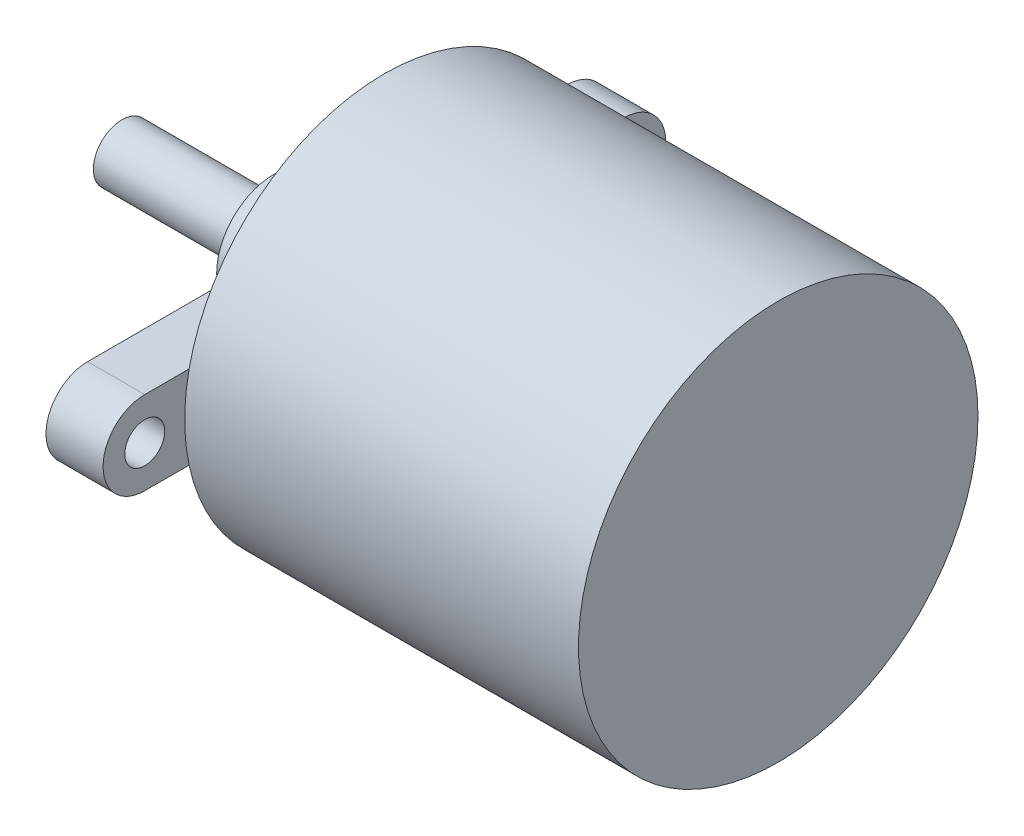
ISO-10303-21;
HEADER;
FILE_DESCRIPTION(('STEP AP214'),'2;1');
FILE_NAME('part.step','',(''),(''),'','','');
FILE_SCHEMA(('AUTOMOTIVE_DESIGN { 1 0 10303 214 1 1 1 1 }'));
ENDSEC;
DATA;
#1=APPLICATION_CONTEXT('core data for automotive mechanical design processes');
#2=APPLICATION_PROTOCOL_DEFINITION('international standard','automotive_design',2000,#1);
#3=PRODUCT_CONTEXT('',#1,'mechanical');
#4=PRODUCT('Part','Part','',(#3));
#5=PRODUCT_RELATED_PRODUCT_CATEGORY('part','',(#4));
#6=PRODUCT_DEFINITION_FORMATION('','',#4);
#7=PRODUCT_DEFINITION_CONTEXT('part definition',#1,'design');
#8=PRODUCT_DEFINITION('design','',#6,#7);
#9=PRODUCT_DEFINITION_SHAPE('','',#8);
#10=(LENGTH_UNIT() NAMED_UNIT(*) SI_UNIT(.MILLI.,.METRE.));
#11=(NAMED_UNIT(*) PLANE_ANGLE_UNIT() SI_UNIT($,.RADIAN.));
#12=(NAMED_UNIT(*) SI_UNIT($,.STERADIAN.) SOLID_ANGLE_UNIT());
#13=UNCERTAINTY_MEASURE_WITH_UNIT(LENGTH_MEASURE(1.E-05),#10,'distance_accuracy_value','');
#14=(GEOMETRIC_REPRESENTATION_CONTEXT(3) GLOBAL_UNCERTAINTY_ASSIGNED_CONTEXT((#13)) GLOBAL_UNIT_ASSIGNED_CONTEXT((#10,
#11,#12)) REPRESENTATION_CONTEXT('',''));
#15=CARTESIAN_POINT('',(0.,0.,0.));
#16=DIRECTION('',(0.,0.,1.));
#17=DIRECTION('',(1.,0.,0.));
#18=AXIS2_PLACEMENT_3D('',#15,#16,#17);
#19=CARTESIAN_POINT('',(-9.7,0.,0.));
#20=DIRECTION('',(-1.,0.,0.));
#21=DIRECTION('',(0.,0.,1.));
#22=AXIS2_PLACEMENT_3D('',#19,#20,#21);
#23=PLANE('',#22);
#24=CARTESIAN_POINT('',(-9.7,0.,0.));
#25=DIRECTION('',(-1.,0.,0.));
#26=DIRECTION('',(0.,0.,1.));
#27=AXIS2_PLACEMENT_3D('',#24,#25,#26);
#28=CIRCLE('',#27,5.);
#29=CARTESIAN_POINT('',(-9.7,0.,5.));
#30=VERTEX_POINT('',#29);
#31=EDGE_CURVE('E124',#30,#30,#28,.T.);
#32=ORIENTED_EDGE('',*,*,#31,.T.);
#33=EDGE_LOOP('',(#32));
#34=FACE_BOUND('',#33,.T.);
#35=CARTESIAN_POINT('',(-9.7,0.,0.));
#36=DIRECTION('',(-1.,0.,0.));
#37=DIRECTION('',(0.,0.,1.));
#38=AXIS2_PLACEMENT_3D('',#35,#36,#37);
#39=CIRCLE('',#38,2.5);
#40=CARTESIAN_POINT('',(-9.7,0.,2.5));
#41=VERTEX_POINT('',#40);
#42=EDGE_CURVE('E380',#41,#41,#39,.T.);
#43=ORIENTED_EDGE('',*,*,#42,.F.);
#44=EDGE_LOOP('',(#43));
#45=FACE_BOUND('',#44,.T.);
#46=ADVANCED_FACE('F33',(#34,#45),#23,.T.);
#47=CARTESIAN_POINT('',(-5.,0.,-21.));
#48=DIRECTION('',(-1.,0.,0.));
#49=DIRECTION('',(0.,0.,1.));
#50=AXIS2_PLACEMENT_3D('',#47,#48,#49);
#51=PLANE('',#50);
#52=CARTESIAN_POINT('',(-5.,0.,0.));
#53=DIRECTION('',(-1.,0.,0.));
#54=DIRECTION('',(0.,0.,1.));
#55=AXIS2_PLACEMENT_3D('',#52,#53,#54);
#56=CIRCLE('',#55,5.);
#57=CARTESIAN_POINT('',(-5.,3.65000000000001,-3.41723572496834));
#58=VERTEX_POINT('',#57);
#59=CARTESIAN_POINT('',(-5.,-3.65,-3.41723572496835));
#60=VERTEX_POINT('',#59);
#61=EDGE_CURVE('E11',#58,#60,#56,.T.);
#62=ORIENTED_EDGE('',*,*,#61,.F.);
#63=DIRECTION('',(0.,0.,-1.));
#64=VECTOR('',#63,1.);
#65=CARTESIAN_POINT('',(-5.,3.65000000000001,-21.));
#66=LINE('',#65,#64);
#67=CARTESIAN_POINT('',(-5.,3.65000000000001,-21.));
#68=VERTEX_POINT('',#67);
#69=EDGE_CURVE('E109',#58,#68,#66,.T.);
#70=ORIENTED_EDGE('',*,*,#69,.T.);
#71=CARTESIAN_POINT('',(-5.,0.,-21.));
#72=DIRECTION('',(-1.,0.,0.));
#73=DIRECTION('',(0.,0.,1.));
#74=AXIS2_PLACEMENT_3D('',#71,#72,#73);
#75=CIRCLE('',#74,3.65000000000001);
#76=CARTESIAN_POINT('',(-5.,-3.65000000000001,-21.));
#77=VERTEX_POINT('',#76);
#78=EDGE_CURVE('E143',#68,#77,#75,.T.);
#79=ORIENTED_EDGE('',*,*,#78,.T.);
#80=DIRECTION('',(0.,0.,1.));
#81=VECTOR('',#80,1.);
#82=CARTESIAN_POINT('',(-5.,-3.65000000000001,-21.));
#83=LINE('',#82,#81);
#84=EDGE_CURVE('E148',#77,#60,#83,.T.);
#85=ORIENTED_EDGE('',*,*,#84,.T.);
#86=EDGE_LOOP('',(#62,#70,#79,#85));
#87=FACE_BOUND('',#86,.T.);
#88=CARTESIAN_POINT('',(-5.,-0.140336266117075,-21.));
#89=DIRECTION('',(-1.,0.,0.));
#90=DIRECTION('',(0.,0.,1.));
#91=AXIS2_PLACEMENT_3D('',#88,#89,#90);
#92=CIRCLE('',#91,1.74999999999999);
#93=CARTESIAN_POINT('',(-5.,-0.140336266117075,-19.25));
#94=VERTEX_POINT('',#93);
#95=EDGE_CURVE('E126',#94,#94,#92,.T.);
#96=ORIENTED_EDGE('',*,*,#95,.F.);
#97=EDGE_LOOP('',(#96));
#98=FACE_BOUND('',#97,.T.);
#99=ADVANCED_FACE('F205',(#87,#98),#51,.T.);
#100=CARTESIAN_POINT('',(0.,0.,0.));
#101=DIRECTION('',(1.,0.,0.));
#102=DIRECTION('',(0.,0.,-1.));
#103=AXIS2_PLACEMENT_3D('',#100,#101,#102);
#104=PLANE('',#103);
#105=DIRECTION('',(0.,0.,-1.));
#106=VECTOR('',#105,1.);
#107=CARTESIAN_POINT('',(0.,3.65000000000001,-21.));
#108=LINE('',#107,#106);
#109=CARTESIAN_POINT('',(0.,3.65000000000001,17.1151248899913));
#110=VERTEX_POINT('',#109);
#111=CARTESIAN_POINT('',(0.,3.65000000000001,-17.1151248899913));
#112=VERTEX_POINT('',#111);
#113=EDGE_CURVE('E122',#110,#112,#108,.T.);
#114=ORIENTED_EDGE('',*,*,#113,.F.);
#115=CARTESIAN_POINT('',(0.,0.,0.));
#116=DIRECTION('',(1.,0.,0.));
#117=DIRECTION('',(0.,0.,-1.));
#118=AXIS2_PLACEMENT_3D('',#115,#116,#117);
#119=CIRCLE('',#118,17.5);
#120=EDGE_CURVE('E37',#112,#110,#119,.T.);
#121=ORIENTED_EDGE('',*,*,#120,.F.);
#122=EDGE_LOOP('',(#114,#121));
#123=FACE_BOUND('',#122,.T.);
#124=ADVANCED_FACE('F202',(#123),#104,.F.);
#125=DIRECTION('',(0.,0.,1.));
#126=VECTOR('',#125,1.);
#127=CARTESIAN_POINT('',(0.,-3.65000000000001,-21.));
#128=LINE('',#127,#126);
#129=CARTESIAN_POINT('',(0.,-3.65000000000001,-17.1151248899913));
#130=VERTEX_POINT('',#129);
#131=CARTESIAN_POINT('',(0.,-3.65,17.1151248899913));
#132=VERTEX_POINT('',#131);
#133=EDGE_CURVE('E159',#130,#132,#128,.T.);
#134=ORIENTED_EDGE('',*,*,#133,.F.);
#135=EDGE_CURVE('E183',#132,#130,#119,.T.);
#136=ORIENTED_EDGE('',*,*,#135,.F.);
#137=EDGE_LOOP('',(#134,#136));
#138=FACE_BOUND('',#137,.T.);
#139=ADVANCED_FACE('F204',(#138),#104,.F.);
#140=CARTESIAN_POINT('',(34.5,0.,0.));
#141=DIRECTION('',(-1.,0.,0.));
#142=DIRECTION('',(0.,0.,1.));
#143=AXIS2_PLACEMENT_3D('',#140,#141,#142);
#144=CYLINDRICAL_SURFACE('',#143,17.5);
#145=CARTESIAN_POINT('',(34.5,0.,0.));
#146=DIRECTION('',(1.,0.,0.));
#147=DIRECTION('',(0.,0.,-1.));
#148=AXIS2_PLACEMENT_3D('',#145,#146,#147);
#149=CIRCLE('',#148,17.5);
#150=CARTESIAN_POINT('',(34.5,0.,-17.5));
#151=VERTEX_POINT('',#150);
#152=EDGE_CURVE('E173',#151,#151,#149,.T.);
#153=ORIENTED_EDGE('',*,*,#152,.F.);
#154=EDGE_LOOP('',(#153));
#155=FACE_BOUND('',#154,.T.);
#156=ORIENTED_EDGE('',*,*,#120,.T.);
#157=EDGE_CURVE('E179',#110,#132,#119,.T.);
#158=ORIENTED_EDGE('',*,*,#157,.T.);
#159=ORIENTED_EDGE('',*,*,#135,.T.);
#160=EDGE_CURVE('E172',#130,#112,#119,.T.);
#161=ORIENTED_EDGE('',*,*,#160,.T.);
#162=EDGE_LOOP('',(#156,#158,#159,#161));
#163=FACE_BOUND('',#162,.T.);
#164=ADVANCED_FACE('F35',(#155,#163),#144,.T.);
#165=CARTESIAN_POINT('',(34.5,0.,0.));
#166=DIRECTION('',(1.,0.,0.));
#167=DIRECTION('',(0.,0.,-1.));
#168=AXIS2_PLACEMENT_3D('',#165,#166,#167);
#169=PLANE('',#168);
#170=ORIENTED_EDGE('',*,*,#152,.T.);
#171=EDGE_LOOP('',(#170));
#172=FACE_BOUND('',#171,.T.);
#173=ADVANCED_FACE('F251',(#172),#169,.T.);
#174=CARTESIAN_POINT('',(0.,0.,-21.));
#175=DIRECTION('',(-1.,0.,0.));
#176=DIRECTION('',(0.,0.,1.));
#177=AXIS2_PLACEMENT_3D('',#174,#175,#176);
#178=PLANE('',#177);
#179=CARTESIAN_POINT('',(0.,0.,21.));
#180=DIRECTION('',(-1.,0.,0.));
#181=DIRECTION('',(0.,0.,1.));
#182=AXIS2_PLACEMENT_3D('',#179,#180,#181);
#183=CIRCLE('',#182,1.74999999999999);
#184=CARTESIAN_POINT('',(0.,0.,22.75));
#185=VERTEX_POINT('',#184);
#186=EDGE_CURVE('E139',#185,#185,#183,.T.);
#187=ORIENTED_EDGE('',*,*,#186,.T.);
#188=EDGE_LOOP('',(#187));
#189=FACE_BOUND('',#188,.T.);
#190=ORIENTED_EDGE('',*,*,#157,.F.);
#191=CARTESIAN_POINT('',(0.,3.65000000000002,21.));
#192=VERTEX_POINT('',#191);
#193=EDGE_CURVE('E147',#192,#110,#108,.T.);
#194=ORIENTED_EDGE('',*,*,#193,.F.);
#195=CARTESIAN_POINT('',(0.,0.,21.));
#196=DIRECTION('',(-1.,0.,0.));
#197=DIRECTION('',(0.,0.,1.));
#198=AXIS2_PLACEMENT_3D('',#195,#196,#197);
#199=CIRCLE('',#198,3.65000000000001);
#200=CARTESIAN_POINT('',(0.,-3.65,21.));
#201=VERTEX_POINT('',#200);
#202=EDGE_CURVE('E158',#201,#192,#199,.T.);
#203=ORIENTED_EDGE('',*,*,#202,.F.);
#204=EDGE_CURVE('E154',#132,#201,#128,.T.);
#205=ORIENTED_EDGE('',*,*,#204,.F.);
#206=EDGE_LOOP('',(#190,#194,#203,#205));
#207=FACE_BOUND('',#206,.T.);
#208=ADVANCED_FACE('F241',(#189,#207),#178,.F.);
#209=CARTESIAN_POINT('',(-5.,0.,-21.));
#210=DIRECTION('',(1.,0.,0.));
#211=DIRECTION('',(0.,0.,-1.));
#212=AXIS2_PLACEMENT_3D('',#209,#210,#211);
#213=CYLINDRICAL_SURFACE('',#212,3.65000000000001);
#214=CARTESIAN_POINT('',(0.,0.,-21.));
#215=DIRECTION('',(-1.,0.,0.));
#216=DIRECTION('',(0.,0.,1.));
#217=AXIS2_PLACEMENT_3D('',#214,#215,#216);
#218=CIRCLE('',#217,3.65000000000001);
#219=CARTESIAN_POINT('',(0.,3.65000000000001,-21.));
#220=VERTEX_POINT('',#219);
#221=CARTESIAN_POINT('',(0.,-3.65000000000001,-21.));
#222=VERTEX_POINT('',#221);
#223=EDGE_CURVE('E142',#220,#222,#218,.T.);
#224=ORIENTED_EDGE('',*,*,#223,.T.);
#225=DIRECTION('',(1.,0.,0.));
#226=VECTOR('',#225,1.);
#227=CARTESIAN_POINT('',(-5.,-3.65000000000001,-21.));
#228=LINE('',#227,#226);
#229=EDGE_CURVE('E170',#77,#222,#228,.T.);
#230=ORIENTED_EDGE('',*,*,#229,.F.);
#231=ORIENTED_EDGE('',*,*,#78,.F.);
#232=DIRECTION('',(1.,0.,0.));
#233=VECTOR('',#232,1.);
#234=CARTESIAN_POINT('',(-5.,3.65000000000001,-21.));
#235=LINE('',#234,#233);
#236=EDGE_CURVE('E106',#68,#220,#235,.T.);
#237=ORIENTED_EDGE('',*,*,#236,.T.);
#238=EDGE_LOOP('',(#224,#230,#231,#237));
#239=FACE_BOUND('',#238,.T.);
#240=ADVANCED_FACE('F199',(#239),#213,.T.);
#241=CARTESIAN_POINT('',(-5.,-3.65000000000001,-21.));
#242=DIRECTION('',(0.,1.,0.));
#243=DIRECTION('',(0.,0.,1.));
#244=AXIS2_PLACEMENT_3D('',#241,#242,#243);
#245=PLANE('',#244);
#246=EDGE_CURVE('E155',#222,#130,#128,.T.);
#247=ORIENTED_EDGE('',*,*,#246,.T.);
#248=ORIENTED_EDGE('',*,*,#133,.T.);
#249=ORIENTED_EDGE('',*,*,#204,.T.);
#250=DIRECTION('',(1.,0.,0.));
#251=VECTOR('',#250,1.);
#252=CARTESIAN_POINT('',(-5.,-3.65,21.));
#253=LINE('',#252,#251);
#254=CARTESIAN_POINT('',(-5.,-3.65,21.));
#255=VERTEX_POINT('',#254);
#256=EDGE_CURVE('E167',#255,#201,#253,.T.);
#257=ORIENTED_EDGE('',*,*,#256,.F.);
#258=CARTESIAN_POINT('',(-5.,-3.65,3.41723572496835));
#259=VERTEX_POINT('',#258);
#260=EDGE_CURVE('E146',#259,#255,#83,.T.);
#261=ORIENTED_EDGE('',*,*,#260,.F.);
#262=EDGE_CURVE('E150',#60,#259,#83,.T.);
#263=ORIENTED_EDGE('',*,*,#262,.F.);
#264=ORIENTED_EDGE('',*,*,#84,.F.);
#265=ORIENTED_EDGE('',*,*,#229,.T.);
#266=EDGE_LOOP('',(#247,#248,#249,#257,#261,#263,#264,#265));
#267=FACE_BOUND('',#266,.T.);
#268=ADVANCED_FACE('F195',(#267),#245,.F.);
#269=CARTESIAN_POINT('',(-5.,0.,21.));
#270=DIRECTION('',(1.,0.,0.));
#271=DIRECTION('',(0.,0.,-1.));
#272=AXIS2_PLACEMENT_3D('',#269,#270,#271);
#273=CYLINDRICAL_SURFACE('',#272,3.65000000000001);
#274=ORIENTED_EDGE('',*,*,#202,.T.);
#275=DIRECTION('',(1.,0.,0.));
#276=VECTOR('',#275,1.);
#277=CARTESIAN_POINT('',(-5.,3.65000000000002,21.));
#278=LINE('',#277,#276);
#279=CARTESIAN_POINT('',(-5.,3.65000000000002,21.));
#280=VERTEX_POINT('',#279);
#281=EDGE_CURVE('E165',#280,#192,#278,.T.);
#282=ORIENTED_EDGE('',*,*,#281,.F.);
#283=CARTESIAN_POINT('',(-5.,0.,21.));
#284=DIRECTION('',(-1.,0.,0.));
#285=DIRECTION('',(0.,0.,1.));
#286=AXIS2_PLACEMENT_3D('',#283,#284,#285);
#287=CIRCLE('',#286,3.65000000000001);
#288=EDGE_CURVE('E102',#255,#280,#287,.T.);
#289=ORIENTED_EDGE('',*,*,#288,.F.);
#290=ORIENTED_EDGE('',*,*,#256,.T.);
#291=EDGE_LOOP('',(#274,#282,#289,#290));
#292=FACE_BOUND('',#291,.T.);
#293=ADVANCED_FACE('F244',(#292),#273,.T.);
#294=CARTESIAN_POINT('',(-5.,3.65000000000001,-21.));
#295=DIRECTION('',(0.,-1.,0.));
#296=DIRECTION('',(0.,0.,-1.));
#297=AXIS2_PLACEMENT_3D('',#294,#295,#296);
#298=PLANE('',#297);
#299=ORIENTED_EDGE('',*,*,#193,.T.);
#300=ORIENTED_EDGE('',*,*,#113,.T.);
#301=EDGE_CURVE('E161',#112,#220,#108,.T.);
#302=ORIENTED_EDGE('',*,*,#301,.T.);
#303=ORIENTED_EDGE('',*,*,#236,.F.);
#304=ORIENTED_EDGE('',*,*,#69,.F.);
#305=CARTESIAN_POINT('',(-5.,3.65000000000001,3.41723572496834));
#306=VERTEX_POINT('',#305);
#307=EDGE_CURVE('E107',#306,#58,#66,.T.);
#308=ORIENTED_EDGE('',*,*,#307,.F.);
#309=EDGE_CURVE('E97',#280,#306,#66,.T.);
#310=ORIENTED_EDGE('',*,*,#309,.F.);
#311=ORIENTED_EDGE('',*,*,#281,.T.);
#312=EDGE_LOOP('',(#299,#300,#302,#303,#304,#308,#310,#311));
#313=FACE_BOUND('',#312,.T.);
#314=ADVANCED_FACE('F112',(#313),#298,.F.);
#315=EDGE_CURVE('E42',#259,#306,#56,.T.);
#316=ORIENTED_EDGE('',*,*,#315,.F.);
#317=ORIENTED_EDGE('',*,*,#260,.T.);
#318=ORIENTED_EDGE('',*,*,#288,.T.);
#319=ORIENTED_EDGE('',*,*,#309,.T.);
#320=EDGE_LOOP('',(#316,#317,#318,#319));
#321=FACE_BOUND('',#320,.T.);
#322=CARTESIAN_POINT('',(-5.,0.,21.));
#323=DIRECTION('',(-1.,0.,0.));
#324=DIRECTION('',(0.,0.,1.));
#325=AXIS2_PLACEMENT_3D('',#322,#323,#324);
#326=CIRCLE('',#325,1.74999999999999);
#327=CARTESIAN_POINT('',(-5.,0.,22.75));
#328=VERTEX_POINT('',#327);
#329=EDGE_CURVE('E136',#328,#328,#326,.T.);
#330=ORIENTED_EDGE('',*,*,#329,.F.);
#331=EDGE_LOOP('',(#330));
#332=FACE_BOUND('',#331,.T.);
#333=ADVANCED_FACE('F99',(#321,#332),#51,.T.);
#334=CARTESIAN_POINT('',(0.,-0.140336266117075,-21.));
#335=DIRECTION('',(-1.,0.,0.));
#336=DIRECTION('',(0.,0.,1.));
#337=AXIS2_PLACEMENT_3D('',#334,#335,#336);
#338=CIRCLE('',#337,1.74999999999999);
#339=CARTESIAN_POINT('',(0.,-0.140336266117075,-19.25));
#340=VERTEX_POINT('',#339);
#341=EDGE_CURVE('E133',#340,#340,#338,.T.);
#342=ORIENTED_EDGE('',*,*,#341,.T.);
#343=EDGE_LOOP('',(#342));
#344=FACE_BOUND('',#343,.T.);
#345=ORIENTED_EDGE('',*,*,#160,.F.);
#346=ORIENTED_EDGE('',*,*,#246,.F.);
#347=ORIENTED_EDGE('',*,*,#223,.F.);
#348=ORIENTED_EDGE('',*,*,#301,.F.);
#349=EDGE_LOOP('',(#345,#346,#347,#348));
#350=FACE_BOUND('',#349,.T.);
#351=ADVANCED_FACE('F191',(#344,#350),#178,.F.);
#352=CARTESIAN_POINT('',(-5.,0.,21.));
#353=DIRECTION('',(-1.,0.,0.));
#354=DIRECTION('',(0.,0.,1.));
#355=AXIS2_PLACEMENT_3D('',#352,#353,#354);
#356=CYLINDRICAL_SURFACE('',#355,1.74999999999999);
#357=ORIENTED_EDGE('',*,*,#329,.T.);
#358=EDGE_LOOP('',(#357));
#359=FACE_BOUND('',#358,.T.);
#360=ORIENTED_EDGE('',*,*,#186,.F.);
#361=EDGE_LOOP('',(#360));
#362=FACE_BOUND('',#361,.T.);
#363=ADVANCED_FACE('F232',(#359,#362),#356,.F.);
#364=CARTESIAN_POINT('',(-5.,-0.140336266117075,-21.));
#365=DIRECTION('',(-1.,0.,0.));
#366=DIRECTION('',(0.,0.,1.));
#367=AXIS2_PLACEMENT_3D('',#364,#365,#366);
#368=CYLINDRICAL_SURFACE('',#367,1.74999999999999);
#369=ORIENTED_EDGE('',*,*,#95,.T.);
#370=EDGE_LOOP('',(#369));
#371=FACE_BOUND('',#370,.T.);
#372=ORIENTED_EDGE('',*,*,#341,.F.);
#373=EDGE_LOOP('',(#372));
#374=FACE_BOUND('',#373,.T.);
#375=ADVANCED_FACE('F225',(#371,#374),#368,.F.);
#376=CARTESIAN_POINT('',(-5.,0.,0.));
#377=DIRECTION('',(-1.,0.,0.));
#378=DIRECTION('',(0.,0.,1.));
#379=AXIS2_PLACEMENT_3D('',#376,#377,#378);
#380=PLANE('',#379);
#381=EDGE_CURVE('E44',#60,#259,#56,.T.);
#382=ORIENTED_EDGE('',*,*,#381,.F.);
#383=ORIENTED_EDGE('',*,*,#262,.T.);
#384=EDGE_LOOP('',(#382,#383));
#385=FACE_BOUND('',#384,.T.);
#386=ADVANCED_FACE('F222',(#385),#380,.F.);
#387=EDGE_CURVE('E120',#306,#58,#56,.T.);
#388=ORIENTED_EDGE('',*,*,#387,.F.);
#389=ORIENTED_EDGE('',*,*,#307,.T.);
#390=EDGE_LOOP('',(#388,#389));
#391=FACE_BOUND('',#390,.T.);
#392=ADVANCED_FACE('F123',(#391),#380,.F.);
#393=CARTESIAN_POINT('',(-9.7,0.,0.));
#394=DIRECTION('',(1.,0.,0.));
#395=DIRECTION('',(0.,0.,-1.));
#396=AXIS2_PLACEMENT_3D('',#393,#394,#395);
#397=CYLINDRICAL_SURFACE('',#396,5.);
#398=ORIENTED_EDGE('',*,*,#31,.F.);
#399=EDGE_LOOP('',(#398));
#400=FACE_BOUND('',#399,.T.);
#401=ORIENTED_EDGE('',*,*,#387,.T.);
#402=ORIENTED_EDGE('',*,*,#61,.T.);
#403=ORIENTED_EDGE('',*,*,#381,.T.);
#404=ORIENTED_EDGE('',*,*,#315,.T.);
#405=EDGE_LOOP('',(#401,#402,#403,#404));
#406=FACE_BOUND('',#405,.T.);
#407=ADVANCED_FACE('F119',(#400,#406),#397,.T.);
#408=CARTESIAN_POINT('',(-23.,0.,0.));
#409=DIRECTION('',(1.,0.,0.));
#410=DIRECTION('',(0.,0.,-1.));
#411=AXIS2_PLACEMENT_3D('',#408,#409,#410);
#412=CYLINDRICAL_SURFACE('',#411,2.5);
#413=CARTESIAN_POINT('',(-23.,0.,0.));
#414=DIRECTION('',(-1.,0.,0.));
#415=DIRECTION('',(0.,0.,1.));
#416=AXIS2_PLACEMENT_3D('',#413,#414,#415);
#417=CIRCLE('',#416,2.5);
#418=CARTESIAN_POINT('',(-23.,0.,2.5));
#419=VERTEX_POINT('',#418);
#420=EDGE_CURVE('E128',#419,#419,#417,.T.);
#421=ORIENTED_EDGE('',*,*,#420,.F.);
#422=EDGE_LOOP('',(#421));
#423=FACE_BOUND('',#422,.T.);
#424=ORIENTED_EDGE('',*,*,#42,.T.);
#425=EDGE_LOOP('',(#424));
#426=FACE_BOUND('',#425,.T.);
#427=ADVANCED_FACE('F220',(#423,#426),#412,.T.);
#428=CARTESIAN_POINT('',(-23.,0.,0.));
#429=DIRECTION('',(-1.,0.,0.));
#430=DIRECTION('',(0.,0.,1.));
#431=AXIS2_PLACEMENT_3D('',#428,#429,#430);
#432=PLANE('',#431);
#433=ORIENTED_EDGE('',*,*,#420,.T.);
#434=EDGE_LOOP('',(#433));
#435=FACE_BOUND('',#434,.T.);
#436=ADVANCED_FACE('F355',(#435),#432,.T.);
#437=CLOSED_SHELL('',(#46,#99,#124,#139,#164,#173,#208,#240,#268,#293,#314,#333,#351,#363,#375,
#386,#392,#407,#427,#436));
#438=MANIFOLD_SOLID_BREP('B2',#437);
#439=ADVANCED_BREP_SHAPE_REPRESENTATION('',(#18,#438),#14);
#440=SHAPE_DEFINITION_REPRESENTATION(#9,#439);
ENDSEC;
END-ISO-10303-21;
